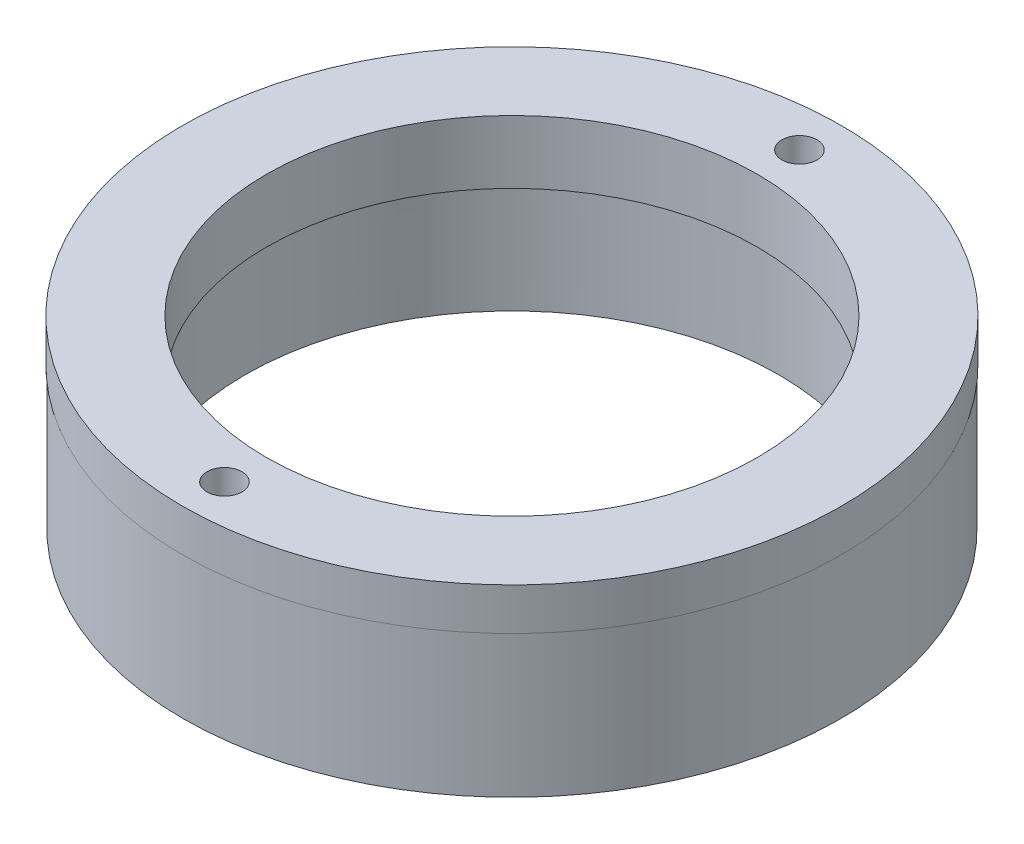
ISO-10303-21;
HEADER;
FILE_DESCRIPTION(('STEP AP214'),'2;1');
FILE_NAME('part.step','',(''),(''),'','','');
FILE_SCHEMA(('AUTOMOTIVE_DESIGN { 1 0 10303 214 1 1 1 1 }'));
ENDSEC;
DATA;
#1=APPLICATION_CONTEXT('core data for automotive mechanical design processes');
#2=APPLICATION_PROTOCOL_DEFINITION('international standard','automotive_design',2000,#1);
#3=PRODUCT_CONTEXT('',#1,'mechanical');
#4=PRODUCT('Part','Part','',(#3));
#5=PRODUCT_RELATED_PRODUCT_CATEGORY('part','',(#4));
#6=PRODUCT_DEFINITION_FORMATION('','',#4);
#7=PRODUCT_DEFINITION_CONTEXT('part definition',#1,'design');
#8=PRODUCT_DEFINITION('design','',#6,#7);
#9=PRODUCT_DEFINITION_SHAPE('','',#8);
#10=(LENGTH_UNIT() NAMED_UNIT(*) SI_UNIT(.MILLI.,.METRE.));
#11=(NAMED_UNIT(*) PLANE_ANGLE_UNIT() SI_UNIT($,.RADIAN.));
#12=(NAMED_UNIT(*) SI_UNIT($,.STERADIAN.) SOLID_ANGLE_UNIT());
#13=UNCERTAINTY_MEASURE_WITH_UNIT(LENGTH_MEASURE(1.E-05),#10,'distance_accuracy_value','');
#14=(GEOMETRIC_REPRESENTATION_CONTEXT(3) GLOBAL_UNCERTAINTY_ASSIGNED_CONTEXT((#13)) GLOBAL_UNIT_ASSIGNED_CONTEXT((#10,
#11,#12)) REPRESENTATION_CONTEXT('',''));
#15=CARTESIAN_POINT('',(0.,0.,0.));
#16=DIRECTION('',(0.,0.,1.));
#17=DIRECTION('',(1.,0.,0.));
#18=AXIS2_PLACEMENT_3D('',#15,#16,#17);
#19=CARTESIAN_POINT('',(0.,0.,0.));
#20=DIRECTION('',(0.,1.,0.));
#21=DIRECTION('',(0.,0.,1.));
#22=AXIS2_PLACEMENT_3D('',#19,#20,#21);
#23=PLANE('',#22);
#24=CARTESIAN_POINT('',(0.,0.,0.));
#25=DIRECTION('',(0.,1.,0.));
#26=DIRECTION('',(0.,0.,1.));
#27=AXIS2_PLACEMENT_3D('',#24,#25,#26);
#28=CIRCLE('',#27,11.938);
#29=CARTESIAN_POINT('',(0.,0.,11.938));
#30=VERTEX_POINT('',#29);
#31=EDGE_CURVE('E47',#30,#30,#28,.T.);
#32=ORIENTED_EDGE('',*,*,#31,.T.);
#33=EDGE_LOOP('',(#32));
#34=FACE_BOUND('',#33,.T.);
#35=CARTESIAN_POINT('',(0.,0.,0.));
#36=DIRECTION('',(0.,1.,0.));
#37=DIRECTION('',(0.,0.,1.));
#38=AXIS2_PLACEMENT_3D('',#35,#36,#37);
#39=CIRCLE('',#38,8.89);
#40=CARTESIAN_POINT('',(0.,0.,8.89));
#41=VERTEX_POINT('',#40);
#42=EDGE_CURVE('E51',#41,#41,#39,.T.);
#43=ORIENTED_EDGE('',*,*,#42,.F.);
#44=EDGE_LOOP('',(#43));
#45=FACE_BOUND('',#44,.T.);
#46=CARTESIAN_POINT('',(0.,0.,-10.414));
#47=DIRECTION('',(0.,1.,0.));
#48=DIRECTION('',(0.,0.,1.));
#49=AXIS2_PLACEMENT_3D('',#46,#47,#48);
#50=CIRCLE('',#49,0.635);
#51=CARTESIAN_POINT('',(0.,0.,-9.779));
#52=VERTEX_POINT('',#51);
#53=EDGE_CURVE('E62',#52,#52,#50,.T.);
#54=ORIENTED_EDGE('',*,*,#53,.F.);
#55=EDGE_LOOP('',(#54));
#56=FACE_BOUND('',#55,.T.);
#57=CARTESIAN_POINT('',(0.,0.,10.414));
#58=DIRECTION('',(0.,-1.,0.));
#59=DIRECTION('',(0.,0.,-1.));
#60=AXIS2_PLACEMENT_3D('',#57,#58,#59);
#61=CIRCLE('',#60,0.635);
#62=CARTESIAN_POINT('',(0.,0.,9.779));
#63=VERTEX_POINT('',#62);
#64=EDGE_CURVE('E69',#63,#63,#61,.T.);
#65=ORIENTED_EDGE('',*,*,#64,.T.);
#66=EDGE_LOOP('',(#65));
#67=FACE_BOUND('',#66,.T.);
#68=ADVANCED_FACE('F32',(#34,#45,#56,#67),#23,.T.);
#69=CARTESIAN_POINT('',(0.,-6.6802,0.));
#70=DIRECTION('',(0.,1.,0.));
#71=DIRECTION('',(0.,0.,1.));
#72=AXIS2_PLACEMENT_3D('',#69,#70,#71);
#73=CYLINDRICAL_SURFACE('',#72,11.9126);
#74=CARTESIAN_POINT('',(0.,-6.6802,0.));
#75=DIRECTION('',(0.,1.,0.));
#76=DIRECTION('',(0.,0.,1.));
#77=AXIS2_PLACEMENT_3D('',#74,#75,#76);
#78=CIRCLE('',#77,11.9126);
#79=CARTESIAN_POINT('',(0.,-6.6802,11.9126));
#80=VERTEX_POINT('',#79);
#81=EDGE_CURVE('E10',#80,#80,#78,.T.);
#82=ORIENTED_EDGE('',*,*,#81,.T.);
#83=EDGE_LOOP('',(#82));
#84=FACE_BOUND('',#83,.T.);
#85=CARTESIAN_POINT('',(0.,-1.524,0.));
#86=DIRECTION('',(0.,1.,0.));
#87=DIRECTION('',(0.,0.,1.));
#88=AXIS2_PLACEMENT_3D('',#85,#86,#87);
#89=CIRCLE('',#88,11.9126);
#90=CARTESIAN_POINT('',(0.,-1.524,11.9126));
#91=VERTEX_POINT('',#90);
#92=EDGE_CURVE('E40',#91,#91,#89,.F.);
#93=ORIENTED_EDGE('',*,*,#92,.T.);
#94=EDGE_LOOP('',(#93));
#95=FACE_BOUND('',#94,.T.);
#96=ADVANCED_FACE('F87',(#84,#95),#73,.T.);
#97=CARTESIAN_POINT('',(0.,-6.6802,0.));
#98=DIRECTION('',(0.,1.,0.));
#99=DIRECTION('',(0.,0.,1.));
#100=AXIS2_PLACEMENT_3D('',#97,#98,#99);
#101=PLANE('',#100);
#102=CARTESIAN_POINT('',(0.,-6.6802,0.));
#103=DIRECTION('',(0.,1.,0.));
#104=DIRECTION('',(0.,0.,1.));
#105=AXIS2_PLACEMENT_3D('',#102,#103,#104);
#106=CIRCLE('',#105,9.6647);
#107=CARTESIAN_POINT('',(0.,-6.6802,9.6647));
#108=VERTEX_POINT('',#107);
#109=EDGE_CURVE('E59',#108,#108,#106,.T.);
#110=ORIENTED_EDGE('',*,*,#109,.T.);
#111=EDGE_LOOP('',(#110));
#112=FACE_BOUND('',#111,.T.);
#113=ORIENTED_EDGE('',*,*,#81,.F.);
#114=EDGE_LOOP('',(#113));
#115=FACE_BOUND('',#114,.T.);
#116=ADVANCED_FACE('F93',(#112,#115),#101,.F.);
#117=CARTESIAN_POINT('',(0.,-1.524,0.));
#118=DIRECTION('',(0.,1.,0.));
#119=DIRECTION('',(0.,0.,1.));
#120=AXIS2_PLACEMENT_3D('',#117,#118,#119);
#121=CYLINDRICAL_SURFACE('',#120,11.938);
#122=CARTESIAN_POINT('',(0.,-1.524,0.));
#123=DIRECTION('',(0.,1.,0.));
#124=DIRECTION('',(0.,0.,1.));
#125=AXIS2_PLACEMENT_3D('',#122,#123,#124);
#126=CIRCLE('',#125,11.938);
#127=CARTESIAN_POINT('',(0.,-1.524,11.938));
#128=VERTEX_POINT('',#127);
#129=EDGE_CURVE('E45',#128,#128,#126,.T.);
#130=CARTESIAN_POINT('',(0.,-1.524,11.938));
#131=CARTESIAN_POINT('',(0.,-1.508125,11.938));
#132=CARTESIAN_POINT('',(0.,-1.49225,11.938));
#133=CARTESIAN_POINT('',(0.,-1.4605,11.938));
#134=CARTESIAN_POINT('',(0.,-1.444625,11.938));
#135=CARTESIAN_POINT('',(0.,-1.412875,11.938));
#136=CARTESIAN_POINT('',(0.,-1.397,11.938));
#137=CARTESIAN_POINT('',(0.,-1.36525,11.938));
#138=CARTESIAN_POINT('',(0.,-1.349375,11.938));
#139=CARTESIAN_POINT('',(0.,-1.317625,11.938));
#140=CARTESIAN_POINT('',(0.,-1.30175,11.938));
#141=CARTESIAN_POINT('',(0.,-1.27,11.938));
#142=CARTESIAN_POINT('',(0.,-1.254125,11.938));
#143=CARTESIAN_POINT('',(0.,-1.222375,11.938));
#144=CARTESIAN_POINT('',(0.,-1.2065,11.938));
#145=CARTESIAN_POINT('',(0.,-1.17475,11.938));
#146=CARTESIAN_POINT('',(0.,-1.158875,11.938));
#147=CARTESIAN_POINT('',(0.,-1.127125,11.938));
#148=CARTESIAN_POINT('',(0.,-1.11125,11.938));
#149=CARTESIAN_POINT('',(0.,-1.0795,11.938));
#150=CARTESIAN_POINT('',(0.,-1.063625,11.938));
#151=CARTESIAN_POINT('',(0.,-1.031875,11.938));
#152=CARTESIAN_POINT('',(0.,-1.016,11.938));
#153=CARTESIAN_POINT('',(0.,-0.98425,11.938));
#154=CARTESIAN_POINT('',(0.,-0.968375,11.938));
#155=CARTESIAN_POINT('',(0.,-0.936625,11.938));
#156=CARTESIAN_POINT('',(0.,-0.92075,11.938));
#157=CARTESIAN_POINT('',(0.,-0.889,11.938));
#158=CARTESIAN_POINT('',(0.,-0.873125,11.938));
#159=CARTESIAN_POINT('',(0.,-0.841375,11.938));
#160=CARTESIAN_POINT('',(0.,-0.8255,11.938));
#161=CARTESIAN_POINT('',(0.,-0.79375,11.938));
#162=CARTESIAN_POINT('',(0.,-0.777875,11.938));
#163=CARTESIAN_POINT('',(0.,-0.746125,11.938));
#164=CARTESIAN_POINT('',(0.,-0.73025,11.938));
#165=CARTESIAN_POINT('',(0.,-0.6985,11.938));
#166=CARTESIAN_POINT('',(0.,-0.682625,11.938));
#167=CARTESIAN_POINT('',(0.,-0.650875,11.938));
#168=CARTESIAN_POINT('',(0.,-0.635,11.938));
#169=CARTESIAN_POINT('',(0.,-0.60325,11.938));
#170=CARTESIAN_POINT('',(0.,-0.587375,11.938));
#171=CARTESIAN_POINT('',(0.,-0.555625,11.938));
#172=CARTESIAN_POINT('',(0.,-0.53975,11.938));
#173=CARTESIAN_POINT('',(0.,-0.508,11.938));
#174=CARTESIAN_POINT('',(0.,-0.492125,11.938));
#175=CARTESIAN_POINT('',(0.,-0.460375,11.938));
#176=CARTESIAN_POINT('',(0.,-0.4445,11.938));
#177=CARTESIAN_POINT('',(0.,-0.41275,11.938));
#178=CARTESIAN_POINT('',(0.,-0.396875,11.938));
#179=CARTESIAN_POINT('',(0.,-0.365125,11.938));
#180=CARTESIAN_POINT('',(0.,-0.34925,11.938));
#181=CARTESIAN_POINT('',(0.,-0.3175,11.938));
#182=CARTESIAN_POINT('',(0.,-0.301625,11.938));
#183=CARTESIAN_POINT('',(0.,-0.269875,11.938));
#184=CARTESIAN_POINT('',(0.,-0.254,11.938));
#185=CARTESIAN_POINT('',(0.,-0.22225,11.938));
#186=CARTESIAN_POINT('',(0.,-0.206375,11.938));
#187=CARTESIAN_POINT('',(0.,-0.174625,11.938));
#188=CARTESIAN_POINT('',(0.,-0.15875,11.938));
#189=CARTESIAN_POINT('',(0.,-0.127,11.938));
#190=CARTESIAN_POINT('',(0.,-0.111125,11.938));
#191=CARTESIAN_POINT('',(0.,-0.079375,11.938));
#192=CARTESIAN_POINT('',(0.,-0.0635,11.938));
#193=CARTESIAN_POINT('',(0.,-0.0317499999999999,11.938));
#194=CARTESIAN_POINT('',(0.,-0.015875,11.938));
#195=CARTESIAN_POINT('',(0.,0.,11.938));
#196=B_SPLINE_CURVE_WITH_KNOTS('',3,(#130,#131,#132,#133,#134,#135,#136,#137,#138,#139,#140,
#141,#142,#143,#144,#145,#146,#147,#148,#149,#150,#151,#152,#153,#154,#155,#156,#157,#158,#159,
#160,#161,#162,#163,#164,#165,#166,#167,#168,#169,#170,#171,#172,#173,#174,#175,#176,#177,#178,
#179,#180,#181,#182,#183,#184,#185,#186,#187,#188,#189,#190,#191,#192,#193,#194,#195),
.UNSPECIFIED.,.F.,.F.,(4,2,2,2,2,2,2,2,2,2,2,2,2,2,2,2,2,2,2,2,2,2,2,2,2,2,2,2,2,2,2,2,4),(0.,
0.0476249999999999,0.0952499999999998,0.142875,0.1905,0.238125,0.28575,0.333375,0.381,0.428625,
0.47625,0.523875,0.5715,0.619125,0.66675,0.714375,0.762,0.809625,0.85725,0.904875,0.9525,
1.000125,1.04775,1.095375,1.143,1.190625,1.23825,1.285875,1.3335,1.381125,1.42875,1.476375,
1.524),.UNSPECIFIED.);
#197=EDGE_CURVE('BSEAM98',#128,#30,#196,.T.);
#198=ORIENTED_EDGE('',*,*,#129,.T.);
#199=ORIENTED_EDGE('',*,*,#31,.F.);
#200=ORIENTED_EDGE('',*,*,#197,.T.);
#201=ORIENTED_EDGE('',*,*,#197,.F.);
#202=EDGE_LOOP('',(#198,#200,#199,#201));
#203=FACE_BOUND('',#202,.T.);
#204=ADVANCED_FACE('F98',(#203),#121,.T.);
#205=CARTESIAN_POINT('',(0.,-1.524,0.));
#206=DIRECTION('',(0.,1.,0.));
#207=DIRECTION('',(0.,0.,1.));
#208=AXIS2_PLACEMENT_3D('',#205,#206,#207);
#209=PLANE('',#208);
#210=ORIENTED_EDGE('',*,*,#92,.F.);
#211=EDGE_LOOP('',(#210));
#212=FACE_BOUND('',#211,.T.);
#213=ORIENTED_EDGE('',*,*,#129,.F.);
#214=EDGE_LOOP('',(#213));
#215=FACE_BOUND('',#214,.T.);
#216=ADVANCED_FACE('F102',(#212,#215),#209,.F.);
#217=CARTESIAN_POINT('',(0.,-2.286,0.));
#218=DIRECTION('',(0.,1.,0.));
#219=DIRECTION('',(0.,0.,1.));
#220=AXIS2_PLACEMENT_3D('',#217,#218,#219);
#221=CYLINDRICAL_SURFACE('',#220,8.89);
#222=CARTESIAN_POINT('',(0.,-2.286,0.));
#223=DIRECTION('',(0.,1.,0.));
#224=DIRECTION('',(0.,0.,1.));
#225=AXIS2_PLACEMENT_3D('',#222,#223,#224);
#226=CIRCLE('',#225,8.89);
#227=CARTESIAN_POINT('',(0.,-2.286,8.89));
#228=VERTEX_POINT('',#227);
#229=EDGE_CURVE('E56',#228,#228,#226,.F.);
#230=ORIENTED_EDGE('',*,*,#229,.T.);
#231=EDGE_LOOP('',(#230));
#232=FACE_BOUND('',#231,.T.);
#233=ORIENTED_EDGE('',*,*,#42,.T.);
#234=EDGE_LOOP('',(#233));
#235=FACE_BOUND('',#234,.T.);
#236=ADVANCED_FACE('F106',(#232,#235),#221,.F.);
#237=CARTESIAN_POINT('',(0.,-2.286,0.));
#238=DIRECTION('',(0.,1.,0.));
#239=DIRECTION('',(0.,0.,1.));
#240=AXIS2_PLACEMENT_3D('',#237,#238,#239);
#241=PLANE('',#240);
#242=CARTESIAN_POINT('',(0.,-2.286,0.));
#243=DIRECTION('',(0.,1.,0.));
#244=DIRECTION('',(0.,0.,1.));
#245=AXIS2_PLACEMENT_3D('',#242,#243,#244);
#246=CIRCLE('',#245,9.64552656382367);
#247=CARTESIAN_POINT('',(0.,-2.286,9.64552656382367));
#248=VERTEX_POINT('',#247);
#249=EDGE_CURVE('E36',#248,#248,#246,.T.);
#250=ORIENTED_EDGE('',*,*,#249,.F.);
#251=EDGE_LOOP('',(#250));
#252=FACE_BOUND('',#251,.T.);
#253=ORIENTED_EDGE('',*,*,#229,.F.);
#254=EDGE_LOOP('',(#253));
#255=FACE_BOUND('',#254,.T.);
#256=ADVANCED_FACE('F110',(#252,#255),#241,.F.);
#257=CARTESIAN_POINT('',(0.,-6.6802,0.));
#258=DIRECTION('',(0.,-1.,0.));
#259=DIRECTION('',(0.,0.,1.));
#260=AXIS2_PLACEMENT_3D('',#257,#258,#259);
#261=CONICAL_SURFACE('',#260,9.6647,0.00436332312998583);
#262=ORIENTED_EDGE('',*,*,#109,.F.);
#263=EDGE_LOOP('',(#262));
#264=FACE_BOUND('',#263,.T.);
#265=ORIENTED_EDGE('',*,*,#249,.T.);
#266=EDGE_LOOP('',(#265));
#267=FACE_BOUND('',#266,.T.);
#268=ADVANCED_FACE('F34',(#264,#267),#261,.F.);
#269=CARTESIAN_POINT('',(0.,-1.524,-10.414));
#270=DIRECTION('',(0.,1.,0.));
#271=DIRECTION('',(0.,0.,1.));
#272=AXIS2_PLACEMENT_3D('',#269,#270,#271);
#273=CYLINDRICAL_SURFACE('',#272,0.635);
#274=CARTESIAN_POINT('',(0.,-1.524,-10.414));
#275=DIRECTION('',(0.,1.,0.));
#276=DIRECTION('',(0.,0.,1.));
#277=AXIS2_PLACEMENT_3D('',#274,#275,#276);
#278=CIRCLE('',#277,0.635);
#279=CARTESIAN_POINT('',(0.,-1.524,-9.779));
#280=VERTEX_POINT('',#279);
#281=EDGE_CURVE('E65',#280,#280,#278,.T.);
#282=ORIENTED_EDGE('',*,*,#281,.F.);
#283=EDGE_LOOP('',(#282));
#284=FACE_BOUND('',#283,.T.);
#285=ORIENTED_EDGE('',*,*,#53,.T.);
#286=EDGE_LOOP('',(#285));
#287=FACE_BOUND('',#286,.T.);
#288=ADVANCED_FACE('F115',(#284,#287),#273,.F.);
#289=CARTESIAN_POINT('',(0.,-1.524,-10.414));
#290=DIRECTION('',(0.,1.,0.));
#291=DIRECTION('',(0.,0.,1.));
#292=AXIS2_PLACEMENT_3D('',#289,#290,#291);
#293=PLANE('',#292);
#294=ORIENTED_EDGE('',*,*,#281,.T.);
#295=EDGE_LOOP('',(#294));
#296=FACE_BOUND('',#295,.T.);
#297=ADVANCED_FACE('F84',(#296),#293,.T.);
#298=CARTESIAN_POINT('',(0.,-1.524,10.414));
#299=DIRECTION('',(0.,1.,0.));
#300=DIRECTION('',(0.,0.,1.));
#301=AXIS2_PLACEMENT_3D('',#298,#299,#300);
#302=CYLINDRICAL_SURFACE('',#301,0.635);
#303=CARTESIAN_POINT('',(0.,-1.524,10.414));
#304=DIRECTION('',(0.,-1.,0.));
#305=DIRECTION('',(0.,0.,-1.));
#306=AXIS2_PLACEMENT_3D('',#303,#304,#305);
#307=CIRCLE('',#306,0.635);
#308=CARTESIAN_POINT('',(0.,-1.524,9.779));
#309=VERTEX_POINT('',#308);
#310=EDGE_CURVE('E66',#309,#309,#307,.T.);
#311=ORIENTED_EDGE('',*,*,#310,.T.);
#312=EDGE_LOOP('',(#311));
#313=FACE_BOUND('',#312,.T.);
#314=ORIENTED_EDGE('',*,*,#64,.F.);
#315=EDGE_LOOP('',(#314));
#316=FACE_BOUND('',#315,.T.);
#317=ADVANCED_FACE('F75',(#313,#316),#302,.F.);
#318=CARTESIAN_POINT('',(0.,-1.524,10.414));
#319=DIRECTION('',(0.,-1.,0.));
#320=DIRECTION('',(0.,0.,-1.));
#321=AXIS2_PLACEMENT_3D('',#318,#319,#320);
#322=PLANE('',#321);
#323=ORIENTED_EDGE('',*,*,#310,.F.);
#324=EDGE_LOOP('',(#323));
#325=FACE_BOUND('',#324,.T.);
#326=ADVANCED_FACE('F78',(#325),#322,.F.);
#327=CLOSED_SHELL('',(#68,#96,#116,#204,#216,#236,#256,#268,#288,#297,#317,#326));
#328=MANIFOLD_SOLID_BREP('B2',#327);
#329=ADVANCED_BREP_SHAPE_REPRESENTATION('',(#18,#328),#14);
#330=SHAPE_DEFINITION_REPRESENTATION(#9,#329);
ENDSEC;
END-ISO-10303-21;
